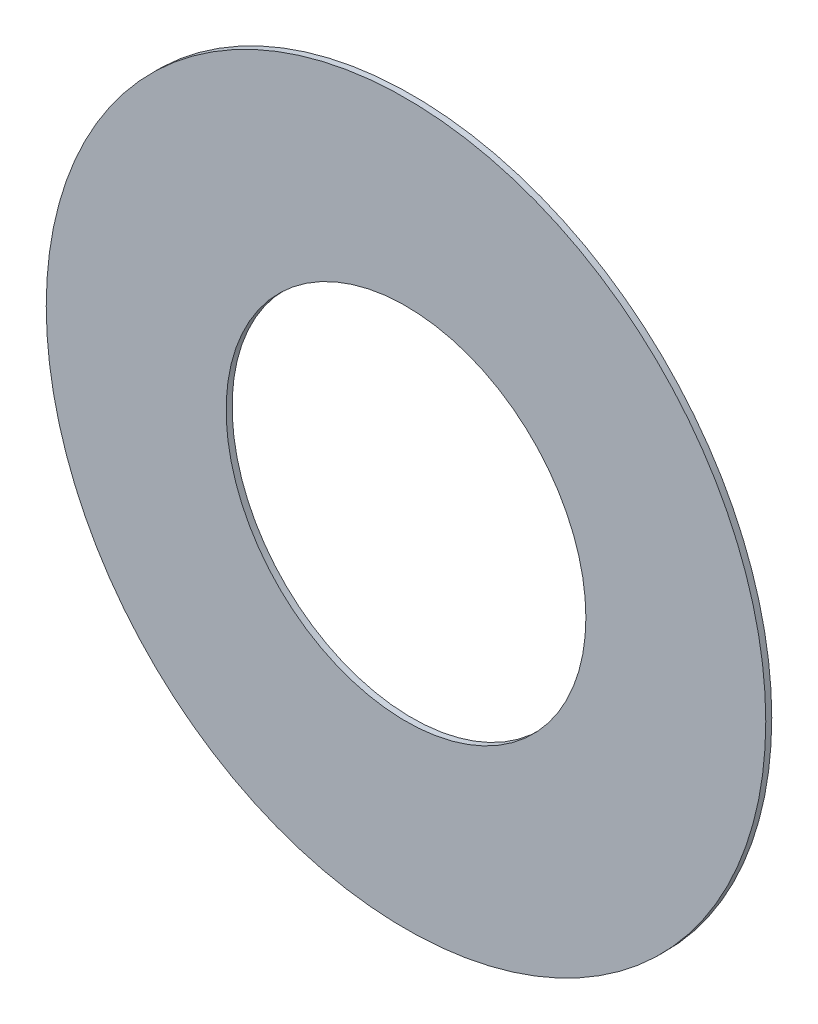
ISO-10303-21;
HEADER;
FILE_DESCRIPTION(('STEP AP214'),'2;1');
FILE_NAME('part.step','',(''),(''),'','','');
FILE_SCHEMA(('AUTOMOTIVE_DESIGN { 1 0 10303 214 1 1 1 1 }'));
ENDSEC;
DATA;
#1=APPLICATION_CONTEXT('core data for automotive mechanical design processes');
#2=APPLICATION_PROTOCOL_DEFINITION('international standard','automotive_design',2000,#1);
#3=PRODUCT_CONTEXT('',#1,'mechanical');
#4=PRODUCT('Part','Part','',(#3));
#5=PRODUCT_RELATED_PRODUCT_CATEGORY('part','',(#4));
#6=PRODUCT_DEFINITION_FORMATION('','',#4);
#7=PRODUCT_DEFINITION_CONTEXT('part definition',#1,'design');
#8=PRODUCT_DEFINITION('design','',#6,#7);
#9=PRODUCT_DEFINITION_SHAPE('','',#8);
#10=(LENGTH_UNIT() NAMED_UNIT(*) SI_UNIT(.MILLI.,.METRE.));
#11=(NAMED_UNIT(*) PLANE_ANGLE_UNIT() SI_UNIT($,.RADIAN.));
#12=(NAMED_UNIT(*) SI_UNIT($,.STERADIAN.) SOLID_ANGLE_UNIT());
#13=UNCERTAINTY_MEASURE_WITH_UNIT(LENGTH_MEASURE(1.E-05),#10,'distance_accuracy_value','');
#14=(GEOMETRIC_REPRESENTATION_CONTEXT(3) GLOBAL_UNCERTAINTY_ASSIGNED_CONTEXT((#13)) GLOBAL_UNIT_ASSIGNED_CONTEXT((#10,
#11,#12)) REPRESENTATION_CONTEXT('',''));
#15=CARTESIAN_POINT('',(0.,0.,0.));
#16=DIRECTION('',(0.,0.,1.));
#17=DIRECTION('',(1.,0.,0.));
#18=AXIS2_PLACEMENT_3D('',#15,#16,#17);
#19=CARTESIAN_POINT('',(0.,0.,0.));
#20=DIRECTION('',(0.,0.,1.));
#21=DIRECTION('',(0.,-1.,0.));
#22=AXIS2_PLACEMENT_3D('',#19,#20,#21);
#23=PLANE('',#22);
#24=CARTESIAN_POINT('',(0.,0.,0.));
#25=DIRECTION('',(0.,0.,-1.));
#26=DIRECTION('',(1.,0.,0.));
#27=AXIS2_PLACEMENT_3D('',#24,#25,#26);
#28=CIRCLE('',#27,6.);
#29=CARTESIAN_POINT('',(6.,0.,0.));
#30=VERTEX_POINT('',#29);
#31=EDGE_CURVE('E11',#30,#30,#28,.T.);
#32=ORIENTED_EDGE('',*,*,#31,.F.);
#33=EDGE_LOOP('',(#32));
#34=FACE_BOUND('',#33,.T.);
#35=CARTESIAN_POINT('',(0.,0.,0.));
#36=DIRECTION('',(0.,0.,-1.));
#37=DIRECTION('',(1.,0.,0.));
#38=AXIS2_PLACEMENT_3D('',#35,#36,#37);
#39=CIRCLE('',#38,3.);
#40=CARTESIAN_POINT('',(3.,0.,0.));
#41=VERTEX_POINT('',#40);
#42=EDGE_CURVE('E60',#41,#41,#39,.T.);
#43=ORIENTED_EDGE('',*,*,#42,.T.);
#44=EDGE_LOOP('',(#43));
#45=FACE_BOUND('',#44,.T.);
#46=ADVANCED_FACE('F41',(#34,#45),#23,.T.);
#47=CARTESIAN_POINT('',(0.,0.,-0.1));
#48=DIRECTION('',(0.,0.,1.));
#49=DIRECTION('',(0.,-1.,0.));
#50=AXIS2_PLACEMENT_3D('',#47,#48,#49);
#51=PLANE('',#50);
#52=CARTESIAN_POINT('',(0.,0.,-0.1));
#53=DIRECTION('',(0.,0.,-1.));
#54=DIRECTION('',(1.,0.,0.));
#55=AXIS2_PLACEMENT_3D('',#52,#53,#54);
#56=CIRCLE('',#55,6.);
#57=CARTESIAN_POINT('',(6.,0.,-0.1));
#58=VERTEX_POINT('',#57);
#59=EDGE_CURVE('E49',#58,#58,#56,.T.);
#60=ORIENTED_EDGE('',*,*,#59,.T.);
#61=EDGE_LOOP('',(#60));
#62=FACE_BOUND('',#61,.T.);
#63=CARTESIAN_POINT('',(0.,0.,-0.1));
#64=DIRECTION('',(0.,0.,-1.));
#65=DIRECTION('',(1.,0.,0.));
#66=AXIS2_PLACEMENT_3D('',#63,#64,#65);
#67=CIRCLE('',#66,3.);
#68=CARTESIAN_POINT('',(3.,0.,-0.1));
#69=VERTEX_POINT('',#68);
#70=EDGE_CURVE('E64',#69,#69,#67,.T.);
#71=ORIENTED_EDGE('',*,*,#70,.F.);
#72=EDGE_LOOP('',(#71));
#73=FACE_BOUND('',#72,.T.);
#74=ADVANCED_FACE('F71',(#62,#73),#51,.F.);
#75=CARTESIAN_POINT('',(0.,0.,-0.1));
#76=DIRECTION('',(0.,0.,1.));
#77=DIRECTION('',(-1.,0.,0.));
#78=AXIS2_PLACEMENT_3D('',#75,#76,#77);
#79=CYLINDRICAL_SURFACE('',#78,6.);
#80=ORIENTED_EDGE('',*,*,#31,.T.);
#81=EDGE_LOOP('',(#80));
#82=FACE_BOUND('',#81,.T.);
#83=ORIENTED_EDGE('',*,*,#59,.F.);
#84=EDGE_LOOP('',(#83));
#85=FACE_BOUND('',#84,.T.);
#86=ADVANCED_FACE('F73',(#82,#85),#79,.T.);
#87=CARTESIAN_POINT('',(0.,0.,-0.1));
#88=DIRECTION('',(0.,0.,1.));
#89=DIRECTION('',(-1.,0.,0.));
#90=AXIS2_PLACEMENT_3D('',#87,#88,#89);
#91=CYLINDRICAL_SURFACE('',#90,3.);
#92=ORIENTED_EDGE('',*,*,#42,.F.);
#93=EDGE_LOOP('',(#92));
#94=FACE_BOUND('',#93,.T.);
#95=ORIENTED_EDGE('',*,*,#70,.T.);
#96=EDGE_LOOP('',(#95));
#97=FACE_BOUND('',#96,.T.);
#98=ADVANCED_FACE('F65',(#94,#97),#91,.F.);
#99=CLOSED_SHELL('',(#46,#74,#86,#98));
#100=MANIFOLD_SOLID_BREP('B2',#99);
#101=ADVANCED_BREP_SHAPE_REPRESENTATION('',(#18,#100),#14);
#102=SHAPE_DEFINITION_REPRESENTATION(#9,#101);
ENDSEC;
END-ISO-10303-21;
